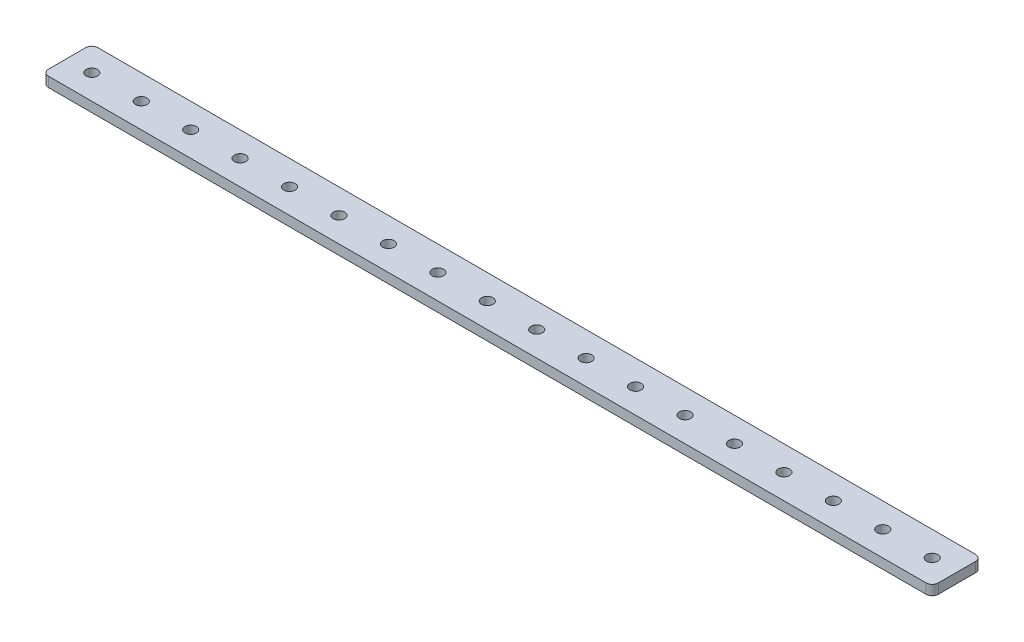
ISO-10303-21;
HEADER;
FILE_DESCRIPTION(('STEP AP214'),'2;1');
FILE_NAME('part.step','',(''),(''),'','','');
FILE_SCHEMA(('AUTOMOTIVE_DESIGN { 1 0 10303 214 1 1 1 1 }'));
ENDSEC;
DATA;
#1=APPLICATION_CONTEXT('core data for automotive mechanical design processes');
#2=APPLICATION_PROTOCOL_DEFINITION('international standard','automotive_design',2000,#1);
#3=PRODUCT_CONTEXT('',#1,'mechanical');
#4=PRODUCT('Part','Part','',(#3));
#5=PRODUCT_RELATED_PRODUCT_CATEGORY('part','',(#4));
#6=PRODUCT_DEFINITION_FORMATION('','',#4);
#7=PRODUCT_DEFINITION_CONTEXT('part definition',#1,'design');
#8=PRODUCT_DEFINITION('design','',#6,#7);
#9=PRODUCT_DEFINITION_SHAPE('','',#8);
#10=(LENGTH_UNIT() NAMED_UNIT(*) SI_UNIT(.MILLI.,.METRE.));
#11=(NAMED_UNIT(*) PLANE_ANGLE_UNIT() SI_UNIT($,.RADIAN.));
#12=(NAMED_UNIT(*) SI_UNIT($,.STERADIAN.) SOLID_ANGLE_UNIT());
#13=UNCERTAINTY_MEASURE_WITH_UNIT(LENGTH_MEASURE(1.E-05),#10,'distance_accuracy_value','');
#14=(GEOMETRIC_REPRESENTATION_CONTEXT(3) GLOBAL_UNCERTAINTY_ASSIGNED_CONTEXT((#13)) GLOBAL_UNIT_ASSIGNED_CONTEXT((#10,
#11,#12)) REPRESENTATION_CONTEXT('',''));
#15=CARTESIAN_POINT('',(0.,0.,0.));
#16=DIRECTION('',(0.,0.,1.));
#17=DIRECTION('',(1.,0.,0.));
#18=AXIS2_PLACEMENT_3D('',#15,#16,#17);
#19=CARTESIAN_POINT('',(0.,3.2,0.));
#20=DIRECTION('',(1.,0.,0.));
#21=DIRECTION('',(0.,0.,-1.));
#22=AXIS2_PLACEMENT_3D('',#19,#20,#21);
#23=PLANE('',#22);
#24=DIRECTION('',(0.,0.,1.));
#25=VECTOR('',#24,1.);
#26=CARTESIAN_POINT('',(0.,0.,0.));
#27=LINE('',#26,#25);
#28=CARTESIAN_POINT('',(0.,0.,-14.));
#29=VERTEX_POINT('',#28);
#30=CARTESIAN_POINT('',(0.,0.,-2.));
#31=VERTEX_POINT('',#30);
#32=EDGE_CURVE('E124',#29,#31,#27,.T.);
#33=ORIENTED_EDGE('',*,*,#32,.T.);
#34=DIRECTION('',(0.,-1.,0.));
#35=VECTOR('',#34,1.);
#36=CARTESIAN_POINT('',(0.,3.2,-2.));
#37=LINE('',#36,#35);
#38=CARTESIAN_POINT('',(0.,3.2,-2.));
#39=VERTEX_POINT('',#38);
#40=EDGE_CURVE('E38',#31,#39,#37,.F.);
#41=ORIENTED_EDGE('',*,*,#40,.T.);
#42=DIRECTION('',(0.,0.,1.));
#43=VECTOR('',#42,1.);
#44=CARTESIAN_POINT('',(0.,3.2,0.));
#45=LINE('',#44,#43);
#46=CARTESIAN_POINT('',(0.,3.2,-14.));
#47=VERTEX_POINT('',#46);
#48=EDGE_CURVE('E122',#47,#39,#45,.T.);
#49=ORIENTED_EDGE('',*,*,#48,.F.);
#50=DIRECTION('',(0.,-1.,0.));
#51=VECTOR('',#50,1.);
#52=CARTESIAN_POINT('',(0.,3.2,-14.));
#53=LINE('',#52,#51);
#54=EDGE_CURVE('E139',#47,#29,#53,.T.);
#55=ORIENTED_EDGE('',*,*,#54,.T.);
#56=EDGE_LOOP('',(#33,#41,#49,#55));
#57=FACE_BOUND('',#56,.T.);
#58=ADVANCED_FACE('F30',(#57),#23,.F.);
#59=CARTESIAN_POINT('',(0.,3.2,0.));
#60=DIRECTION('',(0.,0.,-1.));
#61=DIRECTION('',(-1.,0.,0.));
#62=AXIS2_PLACEMENT_3D('',#59,#60,#61);
#63=PLANE('',#62);
#64=DIRECTION('',(1.,0.,0.));
#65=VECTOR('',#64,1.);
#66=CARTESIAN_POINT('',(0.,3.2,0.));
#67=LINE('',#66,#65);
#68=CARTESIAN_POINT('',(2.,3.2,0.));
#69=VERTEX_POINT('',#68);
#70=CARTESIAN_POINT('',(286.,3.2,0.));
#71=VERTEX_POINT('',#70);
#72=EDGE_CURVE('E155',#69,#71,#67,.T.);
#73=ORIENTED_EDGE('',*,*,#72,.F.);
#74=DIRECTION('',(0.,-1.,0.));
#75=VECTOR('',#74,1.);
#76=CARTESIAN_POINT('',(2.,3.2,0.));
#77=LINE('',#76,#75);
#78=CARTESIAN_POINT('',(2.,0.,0.));
#79=VERTEX_POINT('',#78);
#80=EDGE_CURVE('E148',#69,#79,#77,.T.);
#81=ORIENTED_EDGE('',*,*,#80,.T.);
#82=DIRECTION('',(1.,0.,0.));
#83=VECTOR('',#82,1.);
#84=CARTESIAN_POINT('',(0.,0.,0.));
#85=LINE('',#84,#83);
#86=CARTESIAN_POINT('',(286.,0.,0.));
#87=VERTEX_POINT('',#86);
#88=EDGE_CURVE('E119',#79,#87,#85,.T.);
#89=ORIENTED_EDGE('',*,*,#88,.T.);
#90=DIRECTION('',(0.,-1.,0.));
#91=VECTOR('',#90,1.);
#92=CARTESIAN_POINT('',(286.,3.2,0.));
#93=LINE('',#92,#91);
#94=EDGE_CURVE('E102',#87,#71,#93,.F.);
#95=ORIENTED_EDGE('',*,*,#94,.T.);
#96=EDGE_LOOP('',(#73,#81,#89,#95));
#97=FACE_BOUND('',#96,.T.);
#98=ADVANCED_FACE('F154',(#97),#63,.F.);
#99=CARTESIAN_POINT('',(288.,3.2,0.));
#100=DIRECTION('',(-1.,0.,0.));
#101=DIRECTION('',(0.,0.,1.));
#102=AXIS2_PLACEMENT_3D('',#99,#100,#101);
#103=PLANE('',#102);
#104=DIRECTION('',(0.,0.,-1.));
#105=VECTOR('',#104,1.);
#106=CARTESIAN_POINT('',(288.,0.,0.));
#107=LINE('',#106,#105);
#108=CARTESIAN_POINT('',(288.,0.,-2.));
#109=VERTEX_POINT('',#108);
#110=CARTESIAN_POINT('',(288.,0.,-14.));
#111=VERTEX_POINT('',#110);
#112=EDGE_CURVE('E109',#109,#111,#107,.T.);
#113=ORIENTED_EDGE('',*,*,#112,.T.);
#114=DIRECTION('',(0.,-1.,0.));
#115=VECTOR('',#114,1.);
#116=CARTESIAN_POINT('',(288.,3.2,-14.));
#117=LINE('',#116,#115);
#118=CARTESIAN_POINT('',(288.,3.2,-14.));
#119=VERTEX_POINT('',#118);
#120=EDGE_CURVE('E135',#111,#119,#117,.F.);
#121=ORIENTED_EDGE('',*,*,#120,.T.);
#122=DIRECTION('',(0.,0.,-1.));
#123=VECTOR('',#122,1.);
#124=CARTESIAN_POINT('',(288.,3.2,0.));
#125=LINE('',#124,#123);
#126=CARTESIAN_POINT('',(288.,3.2,-2.));
#127=VERTEX_POINT('',#126);
#128=EDGE_CURVE('E112',#127,#119,#125,.T.);
#129=ORIENTED_EDGE('',*,*,#128,.F.);
#130=DIRECTION('',(0.,-1.,0.));
#131=VECTOR('',#130,1.);
#132=CARTESIAN_POINT('',(288.,3.2,-2.));
#133=LINE('',#132,#131);
#134=EDGE_CURVE('E100',#127,#109,#133,.T.);
#135=ORIENTED_EDGE('',*,*,#134,.T.);
#136=EDGE_LOOP('',(#113,#121,#129,#135));
#137=FACE_BOUND('',#136,.T.);
#138=ADVANCED_FACE('F108',(#137),#103,.F.);
#139=CARTESIAN_POINT('',(0.,3.2,-16.));
#140=DIRECTION('',(0.,0.,1.));
#141=DIRECTION('',(1.,0.,0.));
#142=AXIS2_PLACEMENT_3D('',#139,#140,#141);
#143=PLANE('',#142);
#144=DIRECTION('',(-1.,0.,0.));
#145=VECTOR('',#144,1.);
#146=CARTESIAN_POINT('',(0.,0.,-16.));
#147=LINE('',#146,#145);
#148=CARTESIAN_POINT('',(286.,0.,-16.));
#149=VERTEX_POINT('',#148);
#150=CARTESIAN_POINT('',(2.,0.,-16.));
#151=VERTEX_POINT('',#150);
#152=EDGE_CURVE('E118',#149,#151,#147,.T.);
#153=ORIENTED_EDGE('',*,*,#152,.T.);
#154=DIRECTION('',(0.,-1.,0.));
#155=VECTOR('',#154,1.);
#156=CARTESIAN_POINT('',(2.,3.2,-16.));
#157=LINE('',#156,#155);
#158=CARTESIAN_POINT('',(2.,3.2,-16.));
#159=VERTEX_POINT('',#158);
#160=EDGE_CURVE('E144',#151,#159,#157,.F.);
#161=ORIENTED_EDGE('',*,*,#160,.T.);
#162=DIRECTION('',(-1.,0.,0.));
#163=VECTOR('',#162,1.);
#164=CARTESIAN_POINT('',(0.,3.2,-16.));
#165=LINE('',#164,#163);
#166=CARTESIAN_POINT('',(286.,3.2,-16.));
#167=VERTEX_POINT('',#166);
#168=EDGE_CURVE('E113',#167,#159,#165,.T.);
#169=ORIENTED_EDGE('',*,*,#168,.F.);
#170=DIRECTION('',(0.,-1.,0.));
#171=VECTOR('',#170,1.);
#172=CARTESIAN_POINT('',(286.,3.2,-16.));
#173=LINE('',#172,#171);
#174=EDGE_CURVE('E131',#167,#149,#173,.T.);
#175=ORIENTED_EDGE('',*,*,#174,.T.);
#176=EDGE_LOOP('',(#153,#161,#169,#175));
#177=FACE_BOUND('',#176,.T.);
#178=ADVANCED_FACE('F290',(#177),#143,.F.);
#179=CARTESIAN_POINT('',(0.,3.2,-16.));
#180=DIRECTION('',(0.,-1.,0.));
#181=DIRECTION('',(0.,0.,-1.));
#182=AXIS2_PLACEMENT_3D('',#179,#180,#181);
#183=PLANE('',#182);
#184=CARTESIAN_POINT('',(280.,3.2,-8.));
#185=DIRECTION('',(0.,1.,0.));
#186=DIRECTION('',(0.,0.,1.));
#187=AXIS2_PLACEMENT_3D('',#184,#185,#186);
#188=CIRCLE('',#187,1.85000000000003);
#189=CARTESIAN_POINT('',(280.,3.2,-6.14999999999996));
#190=VERTEX_POINT('',#189);
#191=EDGE_CURVE('E273',#190,#190,#188,.T.);
#192=ORIENTED_EDGE('',*,*,#191,.F.);
#193=EDGE_LOOP('',(#192));
#194=FACE_BOUND('',#193,.T.);
#195=CARTESIAN_POINT('',(264.,3.2,-7.99999999999999));
#196=DIRECTION('',(0.,1.,0.));
#197=DIRECTION('',(0.,0.,1.));
#198=AXIS2_PLACEMENT_3D('',#195,#196,#197);
#199=CIRCLE('',#198,1.85000000000003);
#200=CARTESIAN_POINT('',(264.,3.2,-6.14999999999996));
#201=VERTEX_POINT('',#200);
#202=EDGE_CURVE('E267',#201,#201,#199,.T.);
#203=ORIENTED_EDGE('',*,*,#202,.F.);
#204=EDGE_LOOP('',(#203));
#205=FACE_BOUND('',#204,.T.);
#206=CARTESIAN_POINT('',(248.,3.2,-7.99999999999999));
#207=DIRECTION('',(0.,1.,0.));
#208=DIRECTION('',(0.,0.,1.));
#209=AXIS2_PLACEMENT_3D('',#206,#207,#208);
#210=CIRCLE('',#209,1.85000000000003);
#211=CARTESIAN_POINT('',(248.,3.2,-6.14999999999996));
#212=VERTEX_POINT('',#211);
#213=EDGE_CURVE('E261',#212,#212,#210,.T.);
#214=ORIENTED_EDGE('',*,*,#213,.F.);
#215=EDGE_LOOP('',(#214));
#216=FACE_BOUND('',#215,.T.);
#217=CARTESIAN_POINT('',(232.,3.2,-7.99999999999999));
#218=DIRECTION('',(0.,1.,0.));
#219=DIRECTION('',(0.,0.,1.));
#220=AXIS2_PLACEMENT_3D('',#217,#218,#219);
#221=CIRCLE('',#220,1.85000000000001);
#222=CARTESIAN_POINT('',(232.,3.2,-6.14999999999999));
#223=VERTEX_POINT('',#222);
#224=EDGE_CURVE('E255',#223,#223,#221,.T.);
#225=ORIENTED_EDGE('',*,*,#224,.F.);
#226=EDGE_LOOP('',(#225));
#227=FACE_BOUND('',#226,.T.);
#228=CARTESIAN_POINT('',(216.,3.2,-7.99999999999999));
#229=DIRECTION('',(0.,1.,0.));
#230=DIRECTION('',(0.,0.,1.));
#231=AXIS2_PLACEMENT_3D('',#228,#229,#230);
#232=CIRCLE('',#231,1.85000000000001);
#233=CARTESIAN_POINT('',(216.,3.2,-6.14999999999998));
#234=VERTEX_POINT('',#233);
#235=EDGE_CURVE('E249',#234,#234,#232,.T.);
#236=ORIENTED_EDGE('',*,*,#235,.F.);
#237=EDGE_LOOP('',(#236));
#238=FACE_BOUND('',#237,.T.);
#239=CARTESIAN_POINT('',(200.,3.2,-7.99999999999999));
#240=DIRECTION('',(0.,1.,0.));
#241=DIRECTION('',(0.,0.,1.));
#242=AXIS2_PLACEMENT_3D('',#239,#240,#241);
#243=CIRCLE('',#242,1.85000000000001);
#244=CARTESIAN_POINT('',(200.,3.2,-6.14999999999998));
#245=VERTEX_POINT('',#244);
#246=EDGE_CURVE('E243',#245,#245,#243,.T.);
#247=ORIENTED_EDGE('',*,*,#246,.F.);
#248=EDGE_LOOP('',(#247));
#249=FACE_BOUND('',#248,.T.);
#250=CARTESIAN_POINT('',(184.,3.2,-7.99999999999999));
#251=DIRECTION('',(0.,1.,0.));
#252=DIRECTION('',(0.,0.,1.));
#253=AXIS2_PLACEMENT_3D('',#250,#251,#252);
#254=CIRCLE('',#253,1.85000000000001);
#255=CARTESIAN_POINT('',(184.,3.2,-6.14999999999998));
#256=VERTEX_POINT('',#255);
#257=EDGE_CURVE('E237',#256,#256,#254,.T.);
#258=ORIENTED_EDGE('',*,*,#257,.F.);
#259=EDGE_LOOP('',(#258));
#260=FACE_BOUND('',#259,.T.);
#261=CARTESIAN_POINT('',(168.,3.2,-7.99999999999999));
#262=DIRECTION('',(0.,1.,0.));
#263=DIRECTION('',(0.,0.,1.));
#264=AXIS2_PLACEMENT_3D('',#261,#262,#263);
#265=CIRCLE('',#264,1.85000000000001);
#266=CARTESIAN_POINT('',(168.,3.2,-6.14999999999998));
#267=VERTEX_POINT('',#266);
#268=EDGE_CURVE('E231',#267,#267,#265,.T.);
#269=ORIENTED_EDGE('',*,*,#268,.F.);
#270=EDGE_LOOP('',(#269));
#271=FACE_BOUND('',#270,.T.);
#272=CARTESIAN_POINT('',(152.,3.2,-7.99999999999998));
#273=DIRECTION('',(0.,1.,0.));
#274=DIRECTION('',(0.,0.,1.));
#275=AXIS2_PLACEMENT_3D('',#272,#273,#274);
#276=CIRCLE('',#275,1.85);
#277=CARTESIAN_POINT('',(152.,3.2,-6.14999999999998));
#278=VERTEX_POINT('',#277);
#279=EDGE_CURVE('E225',#278,#278,#276,.T.);
#280=ORIENTED_EDGE('',*,*,#279,.F.);
#281=EDGE_LOOP('',(#280));
#282=FACE_BOUND('',#281,.T.);
#283=CARTESIAN_POINT('',(136.,3.2,-7.99999999999998));
#284=DIRECTION('',(0.,1.,0.));
#285=DIRECTION('',(0.,0.,1.));
#286=AXIS2_PLACEMENT_3D('',#283,#284,#285);
#287=CIRCLE('',#286,1.85000000000001);
#288=CARTESIAN_POINT('',(136.,3.2,-6.14999999999998));
#289=VERTEX_POINT('',#288);
#290=EDGE_CURVE('E219',#289,#289,#287,.T.);
#291=ORIENTED_EDGE('',*,*,#290,.F.);
#292=EDGE_LOOP('',(#291));
#293=FACE_BOUND('',#292,.T.);
#294=CARTESIAN_POINT('',(120.,3.2,-7.99999999999998));
#295=DIRECTION('',(0.,1.,0.));
#296=DIRECTION('',(0.,0.,1.));
#297=AXIS2_PLACEMENT_3D('',#294,#295,#296);
#298=CIRCLE('',#297,1.85);
#299=CARTESIAN_POINT('',(120.,3.2,-6.14999999999997));
#300=VERTEX_POINT('',#299);
#301=EDGE_CURVE('E213',#300,#300,#298,.T.);
#302=ORIENTED_EDGE('',*,*,#301,.F.);
#303=EDGE_LOOP('',(#302));
#304=FACE_BOUND('',#303,.T.);
#305=CARTESIAN_POINT('',(104.,3.2,-7.99999999999998));
#306=DIRECTION('',(0.,1.,0.));
#307=DIRECTION('',(0.,0.,1.));
#308=AXIS2_PLACEMENT_3D('',#305,#306,#307);
#309=CIRCLE('',#308,1.85);
#310=CARTESIAN_POINT('',(104.,3.2,-6.14999999999997));
#311=VERTEX_POINT('',#310);
#312=EDGE_CURVE('E207',#311,#311,#309,.T.);
#313=ORIENTED_EDGE('',*,*,#312,.F.);
#314=EDGE_LOOP('',(#313));
#315=FACE_BOUND('',#314,.T.);
#316=CARTESIAN_POINT('',(88.,3.2,-7.99999999999998));
#317=DIRECTION('',(0.,1.,0.));
#318=DIRECTION('',(0.,0.,1.));
#319=AXIS2_PLACEMENT_3D('',#316,#317,#318);
#320=CIRCLE('',#319,1.85);
#321=CARTESIAN_POINT('',(88.,3.2,-6.14999999999997));
#322=VERTEX_POINT('',#321);
#323=EDGE_CURVE('E201',#322,#322,#320,.T.);
#324=ORIENTED_EDGE('',*,*,#323,.F.);
#325=EDGE_LOOP('',(#324));
#326=FACE_BOUND('',#325,.T.);
#327=CARTESIAN_POINT('',(72.,3.2,-7.99999999999998));
#328=DIRECTION('',(0.,1.,0.));
#329=DIRECTION('',(0.,0.,1.));
#330=AXIS2_PLACEMENT_3D('',#327,#328,#329);
#331=CIRCLE('',#330,1.85);
#332=CARTESIAN_POINT('',(72.,3.2,-6.14999999999997));
#333=VERTEX_POINT('',#332);
#334=EDGE_CURVE('E195',#333,#333,#331,.T.);
#335=ORIENTED_EDGE('',*,*,#334,.F.);
#336=EDGE_LOOP('',(#335));
#337=FACE_BOUND('',#336,.T.);
#338=CARTESIAN_POINT('',(56.,3.2,-7.99999999999997));
#339=DIRECTION('',(0.,1.,0.));
#340=DIRECTION('',(0.,0.,1.));
#341=AXIS2_PLACEMENT_3D('',#338,#339,#340);
#342=CIRCLE('',#341,1.85);
#343=CARTESIAN_POINT('',(56.,3.2,-6.14999999999996));
#344=VERTEX_POINT('',#343);
#345=EDGE_CURVE('E189',#344,#344,#342,.T.);
#346=ORIENTED_EDGE('',*,*,#345,.F.);
#347=EDGE_LOOP('',(#346));
#348=FACE_BOUND('',#347,.T.);
#349=CARTESIAN_POINT('',(40.,3.2,-7.99999999999997));
#350=DIRECTION('',(0.,1.,0.));
#351=DIRECTION('',(0.,0.,1.));
#352=AXIS2_PLACEMENT_3D('',#349,#350,#351);
#353=CIRCLE('',#352,1.85);
#354=CARTESIAN_POINT('',(40.,3.2,-6.14999999999997));
#355=VERTEX_POINT('',#354);
#356=EDGE_CURVE('E183',#355,#355,#353,.T.);
#357=ORIENTED_EDGE('',*,*,#356,.F.);
#358=EDGE_LOOP('',(#357));
#359=FACE_BOUND('',#358,.T.);
#360=CARTESIAN_POINT('',(24.,3.2,-7.99999999999997));
#361=DIRECTION('',(0.,1.,0.));
#362=DIRECTION('',(0.,0.,1.));
#363=AXIS2_PLACEMENT_3D('',#360,#361,#362);
#364=CIRCLE('',#363,1.85);
#365=CARTESIAN_POINT('',(24.,3.2,-6.14999999999997));
#366=VERTEX_POINT('',#365);
#367=EDGE_CURVE('E177',#366,#366,#364,.T.);
#368=ORIENTED_EDGE('',*,*,#367,.F.);
#369=EDGE_LOOP('',(#368));
#370=FACE_BOUND('',#369,.T.);
#371=CARTESIAN_POINT('',(8.,3.2,-8.));
#372=DIRECTION('',(0.,1.,0.));
#373=DIRECTION('',(0.,0.,1.));
#374=AXIS2_PLACEMENT_3D('',#371,#372,#373);
#375=CIRCLE('',#374,1.85);
#376=CARTESIAN_POINT('',(8.,3.2,-6.15));
#377=VERTEX_POINT('',#376);
#378=EDGE_CURVE('E166',#377,#377,#375,.T.);
#379=ORIENTED_EDGE('',*,*,#378,.F.);
#380=EDGE_LOOP('',(#379));
#381=FACE_BOUND('',#380,.T.);
#382=ORIENTED_EDGE('',*,*,#48,.T.);
#383=CARTESIAN_POINT('',(2.,3.2,-2.));
#384=DIRECTION('',(0.,-1.,0.));
#385=DIRECTION('',(0.,0.,-1.));
#386=AXIS2_PLACEMENT_3D('',#383,#384,#385);
#387=CIRCLE('',#386,2.);
#388=EDGE_CURVE('E11',#39,#69,#387,.F.);
#389=ORIENTED_EDGE('',*,*,#388,.T.);
#390=ORIENTED_EDGE('',*,*,#72,.T.);
#391=CARTESIAN_POINT('',(286.,3.2,-2.));
#392=DIRECTION('',(0.,-1.,0.));
#393=DIRECTION('',(0.,0.,-1.));
#394=AXIS2_PLACEMENT_3D('',#391,#392,#393);
#395=CIRCLE('',#394,2.);
#396=EDGE_CURVE('E129',#71,#127,#395,.F.);
#397=ORIENTED_EDGE('',*,*,#396,.T.);
#398=ORIENTED_EDGE('',*,*,#128,.T.);
#399=CARTESIAN_POINT('',(286.,3.2,-14.));
#400=DIRECTION('',(0.,-1.,0.));
#401=DIRECTION('',(0.,0.,-1.));
#402=AXIS2_PLACEMENT_3D('',#399,#400,#401);
#403=CIRCLE('',#402,2.);
#404=EDGE_CURVE('E137',#119,#167,#403,.F.);
#405=ORIENTED_EDGE('',*,*,#404,.T.);
#406=ORIENTED_EDGE('',*,*,#168,.T.);
#407=CARTESIAN_POINT('',(2.,3.2,-14.));
#408=DIRECTION('',(0.,-1.,0.));
#409=DIRECTION('',(0.,0.,-1.));
#410=AXIS2_PLACEMENT_3D('',#407,#408,#409);
#411=CIRCLE('',#410,2.);
#412=EDGE_CURVE('E146',#159,#47,#411,.F.);
#413=ORIENTED_EDGE('',*,*,#412,.T.);
#414=EDGE_LOOP('',(#382,#389,#390,#397,#398,#405,#406,#413));
#415=FACE_BOUND('',#414,.T.);
#416=ADVANCED_FACE('F159',(#194,#205,#216,#227,#238,#249,#260,#271,#282,#293,#304,#315,#326,
#337,#348,#359,#370,#381,#415),#183,.F.);
#417=CARTESIAN_POINT('',(0.,0.,-16.));
#418=DIRECTION('',(0.,-1.,0.));
#419=DIRECTION('',(0.,0.,-1.));
#420=AXIS2_PLACEMENT_3D('',#417,#418,#419);
#421=PLANE('',#420);
#422=CARTESIAN_POINT('',(280.,0.,-8.));
#423=DIRECTION('',(0.,1.,0.));
#424=DIRECTION('',(0.,0.,1.));
#425=AXIS2_PLACEMENT_3D('',#422,#423,#424);
#426=CIRCLE('',#425,1.85000000000003);
#427=CARTESIAN_POINT('',(280.,0.,-6.14999999999996));
#428=VERTEX_POINT('',#427);
#429=EDGE_CURVE('E270',#428,#428,#426,.T.);
#430=ORIENTED_EDGE('',*,*,#429,.T.);
#431=EDGE_LOOP('',(#430));
#432=FACE_BOUND('',#431,.T.);
#433=CARTESIAN_POINT('',(264.,0.,-7.99999999999999));
#434=DIRECTION('',(0.,1.,0.));
#435=DIRECTION('',(0.,0.,1.));
#436=AXIS2_PLACEMENT_3D('',#433,#434,#435);
#437=CIRCLE('',#436,1.85000000000003);
#438=CARTESIAN_POINT('',(264.,0.,-6.14999999999996));
#439=VERTEX_POINT('',#438);
#440=EDGE_CURVE('E264',#439,#439,#437,.T.);
#441=ORIENTED_EDGE('',*,*,#440,.T.);
#442=EDGE_LOOP('',(#441));
#443=FACE_BOUND('',#442,.T.);
#444=CARTESIAN_POINT('',(248.,0.,-7.99999999999999));
#445=DIRECTION('',(0.,1.,0.));
#446=DIRECTION('',(0.,0.,1.));
#447=AXIS2_PLACEMENT_3D('',#444,#445,#446);
#448=CIRCLE('',#447,1.85000000000003);
#449=CARTESIAN_POINT('',(248.,0.,-6.14999999999996));
#450=VERTEX_POINT('',#449);
#451=EDGE_CURVE('E258',#450,#450,#448,.T.);
#452=ORIENTED_EDGE('',*,*,#451,.T.);
#453=EDGE_LOOP('',(#452));
#454=FACE_BOUND('',#453,.T.);
#455=CARTESIAN_POINT('',(232.,0.,-7.99999999999999));
#456=DIRECTION('',(0.,1.,0.));
#457=DIRECTION('',(0.,0.,1.));
#458=AXIS2_PLACEMENT_3D('',#455,#456,#457);
#459=CIRCLE('',#458,1.85000000000001);
#460=CARTESIAN_POINT('',(232.,0.,-6.14999999999999));
#461=VERTEX_POINT('',#460);
#462=EDGE_CURVE('E252',#461,#461,#459,.T.);
#463=ORIENTED_EDGE('',*,*,#462,.T.);
#464=EDGE_LOOP('',(#463));
#465=FACE_BOUND('',#464,.T.);
#466=CARTESIAN_POINT('',(216.,0.,-7.99999999999999));
#467=DIRECTION('',(0.,1.,0.));
#468=DIRECTION('',(0.,0.,1.));
#469=AXIS2_PLACEMENT_3D('',#466,#467,#468);
#470=CIRCLE('',#469,1.85000000000001);
#471=CARTESIAN_POINT('',(216.,0.,-6.14999999999998));
#472=VERTEX_POINT('',#471);
#473=EDGE_CURVE('E246',#472,#472,#470,.T.);
#474=ORIENTED_EDGE('',*,*,#473,.T.);
#475=EDGE_LOOP('',(#474));
#476=FACE_BOUND('',#475,.T.);
#477=CARTESIAN_POINT('',(200.,0.,-7.99999999999999));
#478=DIRECTION('',(0.,1.,0.));
#479=DIRECTION('',(0.,0.,1.));
#480=AXIS2_PLACEMENT_3D('',#477,#478,#479);
#481=CIRCLE('',#480,1.85000000000001);
#482=CARTESIAN_POINT('',(200.,0.,-6.14999999999998));
#483=VERTEX_POINT('',#482);
#484=EDGE_CURVE('E240',#483,#483,#481,.T.);
#485=ORIENTED_EDGE('',*,*,#484,.T.);
#486=EDGE_LOOP('',(#485));
#487=FACE_BOUND('',#486,.T.);
#488=CARTESIAN_POINT('',(184.,0.,-7.99999999999999));
#489=DIRECTION('',(0.,1.,0.));
#490=DIRECTION('',(0.,0.,1.));
#491=AXIS2_PLACEMENT_3D('',#488,#489,#490);
#492=CIRCLE('',#491,1.85000000000001);
#493=CARTESIAN_POINT('',(184.,0.,-6.14999999999998));
#494=VERTEX_POINT('',#493);
#495=EDGE_CURVE('E234',#494,#494,#492,.T.);
#496=ORIENTED_EDGE('',*,*,#495,.T.);
#497=EDGE_LOOP('',(#496));
#498=FACE_BOUND('',#497,.T.);
#499=CARTESIAN_POINT('',(168.,0.,-7.99999999999999));
#500=DIRECTION('',(0.,1.,0.));
#501=DIRECTION('',(0.,0.,1.));
#502=AXIS2_PLACEMENT_3D('',#499,#500,#501);
#503=CIRCLE('',#502,1.85000000000001);
#504=CARTESIAN_POINT('',(168.,0.,-6.14999999999998));
#505=VERTEX_POINT('',#504);
#506=EDGE_CURVE('E228',#505,#505,#503,.T.);
#507=ORIENTED_EDGE('',*,*,#506,.T.);
#508=EDGE_LOOP('',(#507));
#509=FACE_BOUND('',#508,.T.);
#510=CARTESIAN_POINT('',(152.,0.,-7.99999999999998));
#511=DIRECTION('',(0.,1.,0.));
#512=DIRECTION('',(0.,0.,1.));
#513=AXIS2_PLACEMENT_3D('',#510,#511,#512);
#514=CIRCLE('',#513,1.85);
#515=CARTESIAN_POINT('',(152.,0.,-6.14999999999998));
#516=VERTEX_POINT('',#515);
#517=EDGE_CURVE('E222',#516,#516,#514,.T.);
#518=ORIENTED_EDGE('',*,*,#517,.T.);
#519=EDGE_LOOP('',(#518));
#520=FACE_BOUND('',#519,.T.);
#521=CARTESIAN_POINT('',(136.,0.,-7.99999999999998));
#522=DIRECTION('',(0.,1.,0.));
#523=DIRECTION('',(0.,0.,1.));
#524=AXIS2_PLACEMENT_3D('',#521,#522,#523);
#525=CIRCLE('',#524,1.85000000000001);
#526=CARTESIAN_POINT('',(136.,0.,-6.14999999999998));
#527=VERTEX_POINT('',#526);
#528=EDGE_CURVE('E216',#527,#527,#525,.T.);
#529=ORIENTED_EDGE('',*,*,#528,.T.);
#530=EDGE_LOOP('',(#529));
#531=FACE_BOUND('',#530,.T.);
#532=CARTESIAN_POINT('',(120.,0.,-7.99999999999998));
#533=DIRECTION('',(0.,1.,0.));
#534=DIRECTION('',(0.,0.,1.));
#535=AXIS2_PLACEMENT_3D('',#532,#533,#534);
#536=CIRCLE('',#535,1.85);
#537=CARTESIAN_POINT('',(120.,0.,-6.14999999999997));
#538=VERTEX_POINT('',#537);
#539=EDGE_CURVE('E210',#538,#538,#536,.T.);
#540=ORIENTED_EDGE('',*,*,#539,.T.);
#541=EDGE_LOOP('',(#540));
#542=FACE_BOUND('',#541,.T.);
#543=CARTESIAN_POINT('',(104.,0.,-7.99999999999998));
#544=DIRECTION('',(0.,1.,0.));
#545=DIRECTION('',(0.,0.,1.));
#546=AXIS2_PLACEMENT_3D('',#543,#544,#545);
#547=CIRCLE('',#546,1.85);
#548=CARTESIAN_POINT('',(104.,0.,-6.14999999999997));
#549=VERTEX_POINT('',#548);
#550=EDGE_CURVE('E204',#549,#549,#547,.T.);
#551=ORIENTED_EDGE('',*,*,#550,.T.);
#552=EDGE_LOOP('',(#551));
#553=FACE_BOUND('',#552,.T.);
#554=CARTESIAN_POINT('',(88.,0.,-7.99999999999998));
#555=DIRECTION('',(0.,1.,0.));
#556=DIRECTION('',(0.,0.,1.));
#557=AXIS2_PLACEMENT_3D('',#554,#555,#556);
#558=CIRCLE('',#557,1.85);
#559=CARTESIAN_POINT('',(88.,0.,-6.14999999999997));
#560=VERTEX_POINT('',#559);
#561=EDGE_CURVE('E198',#560,#560,#558,.T.);
#562=ORIENTED_EDGE('',*,*,#561,.T.);
#563=EDGE_LOOP('',(#562));
#564=FACE_BOUND('',#563,.T.);
#565=CARTESIAN_POINT('',(72.,0.,-7.99999999999998));
#566=DIRECTION('',(0.,1.,0.));
#567=DIRECTION('',(0.,0.,1.));
#568=AXIS2_PLACEMENT_3D('',#565,#566,#567);
#569=CIRCLE('',#568,1.85);
#570=CARTESIAN_POINT('',(72.,0.,-6.14999999999997));
#571=VERTEX_POINT('',#570);
#572=EDGE_CURVE('E192',#571,#571,#569,.T.);
#573=ORIENTED_EDGE('',*,*,#572,.T.);
#574=EDGE_LOOP('',(#573));
#575=FACE_BOUND('',#574,.T.);
#576=CARTESIAN_POINT('',(56.,0.,-7.99999999999997));
#577=DIRECTION('',(0.,1.,0.));
#578=DIRECTION('',(0.,0.,1.));
#579=AXIS2_PLACEMENT_3D('',#576,#577,#578);
#580=CIRCLE('',#579,1.85);
#581=CARTESIAN_POINT('',(56.,0.,-6.14999999999996));
#582=VERTEX_POINT('',#581);
#583=EDGE_CURVE('E186',#582,#582,#580,.T.);
#584=ORIENTED_EDGE('',*,*,#583,.T.);
#585=EDGE_LOOP('',(#584));
#586=FACE_BOUND('',#585,.T.);
#587=CARTESIAN_POINT('',(40.,0.,-7.99999999999997));
#588=DIRECTION('',(0.,1.,0.));
#589=DIRECTION('',(0.,0.,1.));
#590=AXIS2_PLACEMENT_3D('',#587,#588,#589);
#591=CIRCLE('',#590,1.85);
#592=CARTESIAN_POINT('',(40.,0.,-6.14999999999997));
#593=VERTEX_POINT('',#592);
#594=EDGE_CURVE('E180',#593,#593,#591,.T.);
#595=ORIENTED_EDGE('',*,*,#594,.T.);
#596=EDGE_LOOP('',(#595));
#597=FACE_BOUND('',#596,.T.);
#598=CARTESIAN_POINT('',(24.,0.,-7.99999999999997));
#599=DIRECTION('',(0.,1.,0.));
#600=DIRECTION('',(0.,0.,1.));
#601=AXIS2_PLACEMENT_3D('',#598,#599,#600);
#602=CIRCLE('',#601,1.85);
#603=CARTESIAN_POINT('',(24.,0.,-6.14999999999997));
#604=VERTEX_POINT('',#603);
#605=EDGE_CURVE('E175',#604,#604,#602,.T.);
#606=ORIENTED_EDGE('',*,*,#605,.T.);
#607=EDGE_LOOP('',(#606));
#608=FACE_BOUND('',#607,.T.);
#609=CARTESIAN_POINT('',(8.,0.,-8.));
#610=DIRECTION('',(0.,1.,0.));
#611=DIRECTION('',(0.,0.,1.));
#612=AXIS2_PLACEMENT_3D('',#609,#610,#611);
#613=CIRCLE('',#612,1.85);
#614=CARTESIAN_POINT('',(8.,0.,-6.15));
#615=VERTEX_POINT('',#614);
#616=EDGE_CURVE('E170',#615,#615,#613,.T.);
#617=ORIENTED_EDGE('',*,*,#616,.T.);
#618=EDGE_LOOP('',(#617));
#619=FACE_BOUND('',#618,.T.);
#620=ORIENTED_EDGE('',*,*,#88,.F.);
#621=CARTESIAN_POINT('',(2.,0.,-2.));
#622=DIRECTION('',(0.,-1.,0.));
#623=DIRECTION('',(0.,0.,-1.));
#624=AXIS2_PLACEMENT_3D('',#621,#622,#623);
#625=CIRCLE('',#624,2.);
#626=EDGE_CURVE('E52',#79,#31,#625,.T.);
#627=ORIENTED_EDGE('',*,*,#626,.T.);
#628=ORIENTED_EDGE('',*,*,#32,.F.);
#629=CARTESIAN_POINT('',(2.,0.,-14.));
#630=DIRECTION('',(0.,-1.,0.));
#631=DIRECTION('',(0.,0.,-1.));
#632=AXIS2_PLACEMENT_3D('',#629,#630,#631);
#633=CIRCLE('',#632,2.);
#634=EDGE_CURVE('E142',#29,#151,#633,.T.);
#635=ORIENTED_EDGE('',*,*,#634,.T.);
#636=ORIENTED_EDGE('',*,*,#152,.F.);
#637=CARTESIAN_POINT('',(286.,0.,-14.));
#638=DIRECTION('',(0.,-1.,0.));
#639=DIRECTION('',(0.,0.,-1.));
#640=AXIS2_PLACEMENT_3D('',#637,#638,#639);
#641=CIRCLE('',#640,2.);
#642=EDGE_CURVE('E117',#149,#111,#641,.T.);
#643=ORIENTED_EDGE('',*,*,#642,.T.);
#644=ORIENTED_EDGE('',*,*,#112,.F.);
#645=CARTESIAN_POINT('',(286.,0.,-2.));
#646=DIRECTION('',(0.,-1.,0.));
#647=DIRECTION('',(0.,0.,-1.));
#648=AXIS2_PLACEMENT_3D('',#645,#646,#647);
#649=CIRCLE('',#648,2.);
#650=EDGE_CURVE('E96',#109,#87,#649,.T.);
#651=ORIENTED_EDGE('',*,*,#650,.T.);
#652=EDGE_LOOP('',(#620,#627,#628,#635,#636,#643,#644,#651));
#653=FACE_BOUND('',#652,.T.);
#654=ADVANCED_FACE('F115',(#432,#443,#454,#465,#476,#487,#498,#509,#520,#531,#542,#553,#564,
#575,#586,#597,#608,#619,#653),#421,.T.);
#655=CARTESIAN_POINT('',(8.,0.,-8.));
#656=DIRECTION('',(0.,1.,0.));
#657=DIRECTION('',(0.,0.,1.));
#658=AXIS2_PLACEMENT_3D('',#655,#656,#657);
#659=CYLINDRICAL_SURFACE('',#658,1.85);
#660=ORIENTED_EDGE('',*,*,#616,.F.);
#661=EDGE_LOOP('',(#660));
#662=FACE_BOUND('',#661,.T.);
#663=ORIENTED_EDGE('',*,*,#378,.T.);
#664=EDGE_LOOP('',(#663));
#665=FACE_BOUND('',#664,.T.);
#666=ADVANCED_FACE('F326',(#662,#665),#659,.F.);
#667=CARTESIAN_POINT('',(24.,0.,-7.99999999999997));
#668=DIRECTION('',(0.,1.,0.));
#669=DIRECTION('',(0.,0.,1.));
#670=AXIS2_PLACEMENT_3D('',#667,#668,#669);
#671=CYLINDRICAL_SURFACE('',#670,1.85);
#672=ORIENTED_EDGE('',*,*,#605,.F.);
#673=EDGE_LOOP('',(#672));
#674=FACE_BOUND('',#673,.T.);
#675=ORIENTED_EDGE('',*,*,#367,.T.);
#676=EDGE_LOOP('',(#675));
#677=FACE_BOUND('',#676,.T.);
#678=ADVANCED_FACE('F328',(#674,#677),#671,.F.);
#679=CARTESIAN_POINT('',(40.,0.,-7.99999999999997));
#680=DIRECTION('',(0.,1.,0.));
#681=DIRECTION('',(0.,0.,1.));
#682=AXIS2_PLACEMENT_3D('',#679,#680,#681);
#683=CYLINDRICAL_SURFACE('',#682,1.85);
#684=ORIENTED_EDGE('',*,*,#594,.F.);
#685=EDGE_LOOP('',(#684));
#686=FACE_BOUND('',#685,.T.);
#687=ORIENTED_EDGE('',*,*,#356,.T.);
#688=EDGE_LOOP('',(#687));
#689=FACE_BOUND('',#688,.T.);
#690=ADVANCED_FACE('F335',(#686,#689),#683,.F.);
#691=CARTESIAN_POINT('',(56.,0.,-7.99999999999997));
#692=DIRECTION('',(0.,1.,0.));
#693=DIRECTION('',(0.,0.,1.));
#694=AXIS2_PLACEMENT_3D('',#691,#692,#693);
#695=CYLINDRICAL_SURFACE('',#694,1.85);
#696=ORIENTED_EDGE('',*,*,#583,.F.);
#697=EDGE_LOOP('',(#696));
#698=FACE_BOUND('',#697,.T.);
#699=ORIENTED_EDGE('',*,*,#345,.T.);
#700=EDGE_LOOP('',(#699));
#701=FACE_BOUND('',#700,.T.);
#702=ADVANCED_FACE('F533',(#698,#701),#695,.F.);
#703=CARTESIAN_POINT('',(72.,0.,-7.99999999999998));
#704=DIRECTION('',(0.,1.,0.));
#705=DIRECTION('',(0.,0.,1.));
#706=AXIS2_PLACEMENT_3D('',#703,#704,#705);
#707=CYLINDRICAL_SURFACE('',#706,1.85);
#708=ORIENTED_EDGE('',*,*,#572,.F.);
#709=EDGE_LOOP('',(#708));
#710=FACE_BOUND('',#709,.T.);
#711=ORIENTED_EDGE('',*,*,#334,.T.);
#712=EDGE_LOOP('',(#711));
#713=FACE_BOUND('',#712,.T.);
#714=ADVANCED_FACE('F524',(#710,#713),#707,.F.);
#715=CARTESIAN_POINT('',(88.,0.,-7.99999999999998));
#716=DIRECTION('',(0.,1.,0.));
#717=DIRECTION('',(0.,0.,1.));
#718=AXIS2_PLACEMENT_3D('',#715,#716,#717);
#719=CYLINDRICAL_SURFACE('',#718,1.85);
#720=ORIENTED_EDGE('',*,*,#561,.F.);
#721=EDGE_LOOP('',(#720));
#722=FACE_BOUND('',#721,.T.);
#723=ORIENTED_EDGE('',*,*,#323,.T.);
#724=EDGE_LOOP('',(#723));
#725=FACE_BOUND('',#724,.T.);
#726=ADVANCED_FACE('F515',(#722,#725),#719,.F.);
#727=CARTESIAN_POINT('',(104.,0.,-7.99999999999998));
#728=DIRECTION('',(0.,1.,0.));
#729=DIRECTION('',(0.,0.,1.));
#730=AXIS2_PLACEMENT_3D('',#727,#728,#729);
#731=CYLINDRICAL_SURFACE('',#730,1.85);
#732=ORIENTED_EDGE('',*,*,#550,.F.);
#733=EDGE_LOOP('',(#732));
#734=FACE_BOUND('',#733,.T.);
#735=ORIENTED_EDGE('',*,*,#312,.T.);
#736=EDGE_LOOP('',(#735));
#737=FACE_BOUND('',#736,.T.);
#738=ADVANCED_FACE('F506',(#734,#737),#731,.F.);
#739=CARTESIAN_POINT('',(120.,0.,-7.99999999999998));
#740=DIRECTION('',(0.,1.,0.));
#741=DIRECTION('',(0.,0.,1.));
#742=AXIS2_PLACEMENT_3D('',#739,#740,#741);
#743=CYLINDRICAL_SURFACE('',#742,1.85);
#744=ORIENTED_EDGE('',*,*,#539,.F.);
#745=EDGE_LOOP('',(#744));
#746=FACE_BOUND('',#745,.T.);
#747=ORIENTED_EDGE('',*,*,#301,.T.);
#748=EDGE_LOOP('',(#747));
#749=FACE_BOUND('',#748,.T.);
#750=ADVANCED_FACE('F497',(#746,#749),#743,.F.);
#751=CARTESIAN_POINT('',(136.,0.,-7.99999999999998));
#752=DIRECTION('',(0.,1.,0.));
#753=DIRECTION('',(0.,0.,1.));
#754=AXIS2_PLACEMENT_3D('',#751,#752,#753);
#755=CYLINDRICAL_SURFACE('',#754,1.85000000000001);
#756=ORIENTED_EDGE('',*,*,#528,.F.);
#757=EDGE_LOOP('',(#756));
#758=FACE_BOUND('',#757,.T.);
#759=ORIENTED_EDGE('',*,*,#290,.T.);
#760=EDGE_LOOP('',(#759));
#761=FACE_BOUND('',#760,.T.);
#762=ADVANCED_FACE('F488',(#758,#761),#755,.F.);
#763=CARTESIAN_POINT('',(152.,0.,-7.99999999999998));
#764=DIRECTION('',(0.,1.,0.));
#765=DIRECTION('',(0.,0.,1.));
#766=AXIS2_PLACEMENT_3D('',#763,#764,#765);
#767=CYLINDRICAL_SURFACE('',#766,1.85);
#768=ORIENTED_EDGE('',*,*,#517,.F.);
#769=EDGE_LOOP('',(#768));
#770=FACE_BOUND('',#769,.T.);
#771=ORIENTED_EDGE('',*,*,#279,.T.);
#772=EDGE_LOOP('',(#771));
#773=FACE_BOUND('',#772,.T.);
#774=ADVANCED_FACE('F479',(#770,#773),#767,.F.);
#775=CARTESIAN_POINT('',(168.,0.,-7.99999999999999));
#776=DIRECTION('',(0.,1.,0.));
#777=DIRECTION('',(0.,0.,1.));
#778=AXIS2_PLACEMENT_3D('',#775,#776,#777);
#779=CYLINDRICAL_SURFACE('',#778,1.85000000000001);
#780=ORIENTED_EDGE('',*,*,#506,.F.);
#781=EDGE_LOOP('',(#780));
#782=FACE_BOUND('',#781,.T.);
#783=ORIENTED_EDGE('',*,*,#268,.T.);
#784=EDGE_LOOP('',(#783));
#785=FACE_BOUND('',#784,.T.);
#786=ADVANCED_FACE('F470',(#782,#785),#779,.F.);
#787=CARTESIAN_POINT('',(184.,0.,-7.99999999999999));
#788=DIRECTION('',(0.,1.,0.));
#789=DIRECTION('',(0.,0.,1.));
#790=AXIS2_PLACEMENT_3D('',#787,#788,#789);
#791=CYLINDRICAL_SURFACE('',#790,1.85000000000001);
#792=ORIENTED_EDGE('',*,*,#495,.F.);
#793=EDGE_LOOP('',(#792));
#794=FACE_BOUND('',#793,.T.);
#795=ORIENTED_EDGE('',*,*,#257,.T.);
#796=EDGE_LOOP('',(#795));
#797=FACE_BOUND('',#796,.T.);
#798=ADVANCED_FACE('F461',(#794,#797),#791,.F.);
#799=CARTESIAN_POINT('',(200.,0.,-7.99999999999999));
#800=DIRECTION('',(0.,1.,0.));
#801=DIRECTION('',(0.,0.,1.));
#802=AXIS2_PLACEMENT_3D('',#799,#800,#801);
#803=CYLINDRICAL_SURFACE('',#802,1.85000000000001);
#804=ORIENTED_EDGE('',*,*,#484,.F.);
#805=EDGE_LOOP('',(#804));
#806=FACE_BOUND('',#805,.T.);
#807=ORIENTED_EDGE('',*,*,#246,.T.);
#808=EDGE_LOOP('',(#807));
#809=FACE_BOUND('',#808,.T.);
#810=ADVANCED_FACE('F452',(#806,#809),#803,.F.);
#811=CARTESIAN_POINT('',(216.,0.,-7.99999999999999));
#812=DIRECTION('',(0.,1.,0.));
#813=DIRECTION('',(0.,0.,1.));
#814=AXIS2_PLACEMENT_3D('',#811,#812,#813);
#815=CYLINDRICAL_SURFACE('',#814,1.85000000000001);
#816=ORIENTED_EDGE('',*,*,#473,.F.);
#817=EDGE_LOOP('',(#816));
#818=FACE_BOUND('',#817,.T.);
#819=ORIENTED_EDGE('',*,*,#235,.T.);
#820=EDGE_LOOP('',(#819));
#821=FACE_BOUND('',#820,.T.);
#822=ADVANCED_FACE('F443',(#818,#821),#815,.F.);
#823=CARTESIAN_POINT('',(232.,0.,-7.99999999999999));
#824=DIRECTION('',(0.,1.,0.));
#825=DIRECTION('',(0.,0.,1.));
#826=AXIS2_PLACEMENT_3D('',#823,#824,#825);
#827=CYLINDRICAL_SURFACE('',#826,1.85000000000001);
#828=ORIENTED_EDGE('',*,*,#462,.F.);
#829=EDGE_LOOP('',(#828));
#830=FACE_BOUND('',#829,.T.);
#831=ORIENTED_EDGE('',*,*,#224,.T.);
#832=EDGE_LOOP('',(#831));
#833=FACE_BOUND('',#832,.T.);
#834=ADVANCED_FACE('F434',(#830,#833),#827,.F.);
#835=CARTESIAN_POINT('',(248.,0.,-7.99999999999999));
#836=DIRECTION('',(0.,1.,0.));
#837=DIRECTION('',(0.,0.,1.));
#838=AXIS2_PLACEMENT_3D('',#835,#836,#837);
#839=CYLINDRICAL_SURFACE('',#838,1.85000000000003);
#840=ORIENTED_EDGE('',*,*,#451,.F.);
#841=EDGE_LOOP('',(#840));
#842=FACE_BOUND('',#841,.T.);
#843=ORIENTED_EDGE('',*,*,#213,.T.);
#844=EDGE_LOOP('',(#843));
#845=FACE_BOUND('',#844,.T.);
#846=ADVANCED_FACE('F425',(#842,#845),#839,.F.);
#847=CARTESIAN_POINT('',(264.,0.,-7.99999999999999));
#848=DIRECTION('',(0.,1.,0.));
#849=DIRECTION('',(0.,0.,1.));
#850=AXIS2_PLACEMENT_3D('',#847,#848,#849);
#851=CYLINDRICAL_SURFACE('',#850,1.85000000000003);
#852=ORIENTED_EDGE('',*,*,#440,.F.);
#853=EDGE_LOOP('',(#852));
#854=FACE_BOUND('',#853,.T.);
#855=ORIENTED_EDGE('',*,*,#202,.T.);
#856=EDGE_LOOP('',(#855));
#857=FACE_BOUND('',#856,.T.);
#858=ADVANCED_FACE('F284',(#854,#857),#851,.F.);
#859=CARTESIAN_POINT('',(280.,0.,-8.));
#860=DIRECTION('',(0.,1.,0.));
#861=DIRECTION('',(0.,0.,1.));
#862=AXIS2_PLACEMENT_3D('',#859,#860,#861);
#863=CYLINDRICAL_SURFACE('',#862,1.85000000000003);
#864=ORIENTED_EDGE('',*,*,#429,.F.);
#865=EDGE_LOOP('',(#864));
#866=FACE_BOUND('',#865,.T.);
#867=ORIENTED_EDGE('',*,*,#191,.T.);
#868=EDGE_LOOP('',(#867));
#869=FACE_BOUND('',#868,.T.);
#870=ADVANCED_FACE('F281',(#866,#869),#863,.F.);
#871=CARTESIAN_POINT('',(286.,3.2,-2.));
#872=DIRECTION('',(0.,-1.,0.));
#873=DIRECTION('',(0.,0.,-1.));
#874=AXIS2_PLACEMENT_3D('',#871,#872,#873);
#875=CYLINDRICAL_SURFACE('',#874,2.);
#876=ORIENTED_EDGE('',*,*,#396,.F.);
#877=ORIENTED_EDGE('',*,*,#94,.F.);
#878=ORIENTED_EDGE('',*,*,#650,.F.);
#879=ORIENTED_EDGE('',*,*,#134,.F.);
#880=EDGE_LOOP('',(#876,#877,#878,#879));
#881=FACE_BOUND('',#880,.T.);
#882=ADVANCED_FACE('F99',(#881),#875,.T.);
#883=CARTESIAN_POINT('',(286.,3.2,-14.));
#884=DIRECTION('',(0.,-1.,0.));
#885=DIRECTION('',(0.,0.,-1.));
#886=AXIS2_PLACEMENT_3D('',#883,#884,#885);
#887=CYLINDRICAL_SURFACE('',#886,2.);
#888=ORIENTED_EDGE('',*,*,#404,.F.);
#889=ORIENTED_EDGE('',*,*,#120,.F.);
#890=ORIENTED_EDGE('',*,*,#642,.F.);
#891=ORIENTED_EDGE('',*,*,#174,.F.);
#892=EDGE_LOOP('',(#888,#889,#890,#891));
#893=FACE_BOUND('',#892,.T.);
#894=ADVANCED_FACE('F349',(#893),#887,.T.);
#895=CARTESIAN_POINT('',(2.,3.2,-14.));
#896=DIRECTION('',(0.,-1.,0.));
#897=DIRECTION('',(0.,0.,-1.));
#898=AXIS2_PLACEMENT_3D('',#895,#896,#897);
#899=CYLINDRICAL_SURFACE('',#898,2.);
#900=ORIENTED_EDGE('',*,*,#412,.F.);
#901=ORIENTED_EDGE('',*,*,#160,.F.);
#902=ORIENTED_EDGE('',*,*,#634,.F.);
#903=ORIENTED_EDGE('',*,*,#54,.F.);
#904=EDGE_LOOP('',(#900,#901,#902,#903));
#905=FACE_BOUND('',#904,.T.);
#906=ADVANCED_FACE('F351',(#905),#899,.T.);
#907=CARTESIAN_POINT('',(2.,3.2,-2.));
#908=DIRECTION('',(0.,-1.,0.));
#909=DIRECTION('',(0.,0.,-1.));
#910=AXIS2_PLACEMENT_3D('',#907,#908,#909);
#911=CYLINDRICAL_SURFACE('',#910,2.);
#912=ORIENTED_EDGE('',*,*,#388,.F.);
#913=ORIENTED_EDGE('',*,*,#40,.F.);
#914=ORIENTED_EDGE('',*,*,#626,.F.);
#915=ORIENTED_EDGE('',*,*,#80,.F.);
#916=EDGE_LOOP('',(#912,#913,#914,#915));
#917=FACE_BOUND('',#916,.T.);
#918=ADVANCED_FACE('F32',(#917),#911,.T.);
#919=CLOSED_SHELL('',(#58,#98,#138,#178,#416,#654,#666,#678,#690,#702,#714,#726,#738,#750,#762,
#774,#786,#798,#810,#822,#834,#846,#858,#870,#882,#894,#906,#918));
#920=MANIFOLD_SOLID_BREP('B2',#919);
#921=ADVANCED_BREP_SHAPE_REPRESENTATION('',(#18,#920),#14);
#922=SHAPE_DEFINITION_REPRESENTATION(#9,#921);
ENDSEC;
END-ISO-10303-21;
